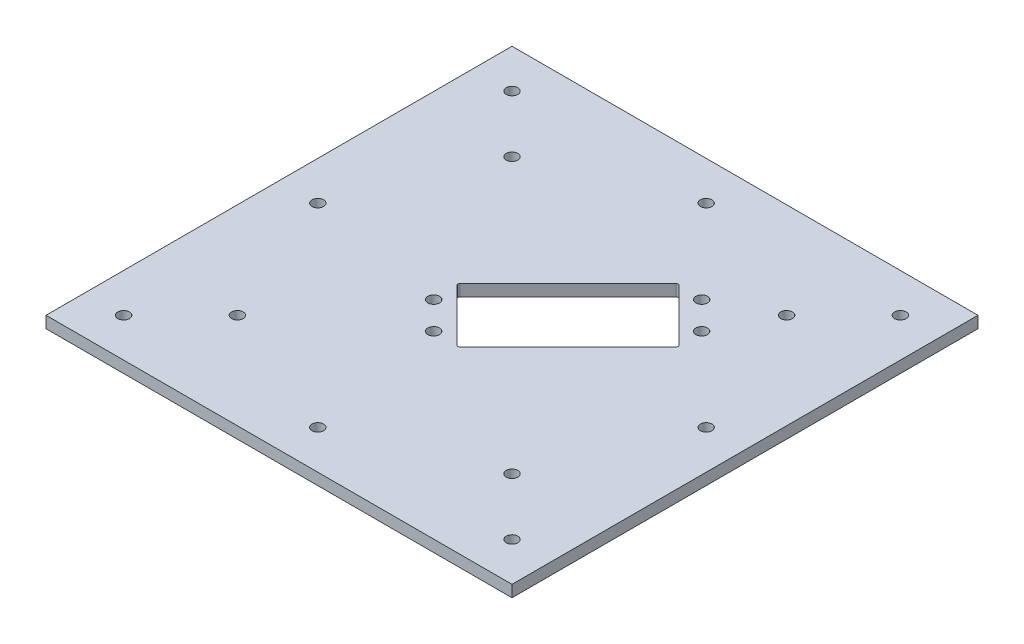
ISO-10303-21;
HEADER;
FILE_DESCRIPTION(('STEP AP214'),'2;1');
FILE_NAME('part.step','',(''),(''),'','','');
FILE_SCHEMA(('AUTOMOTIVE_DESIGN { 1 0 10303 214 1 1 1 1 }'));
ENDSEC;
DATA;
#1=APPLICATION_CONTEXT('core data for automotive mechanical design processes');
#2=APPLICATION_PROTOCOL_DEFINITION('international standard','automotive_design',2000,#1);
#3=PRODUCT_CONTEXT('',#1,'mechanical');
#4=PRODUCT('Part','Part','',(#3));
#5=PRODUCT_RELATED_PRODUCT_CATEGORY('part','',(#4));
#6=PRODUCT_DEFINITION_FORMATION('','',#4);
#7=PRODUCT_DEFINITION_CONTEXT('part definition',#1,'design');
#8=PRODUCT_DEFINITION('design','',#6,#7);
#9=PRODUCT_DEFINITION_SHAPE('','',#8);
#10=(LENGTH_UNIT() NAMED_UNIT(*) SI_UNIT(.MILLI.,.METRE.));
#11=(NAMED_UNIT(*) PLANE_ANGLE_UNIT() SI_UNIT($,.RADIAN.));
#12=(NAMED_UNIT(*) SI_UNIT($,.STERADIAN.) SOLID_ANGLE_UNIT());
#13=UNCERTAINTY_MEASURE_WITH_UNIT(LENGTH_MEASURE(1.E-05),#10,'distance_accuracy_value','');
#14=(GEOMETRIC_REPRESENTATION_CONTEXT(3) GLOBAL_UNCERTAINTY_ASSIGNED_CONTEXT((#13)) GLOBAL_UNIT_ASSIGNED_CONTEXT((#10,
#11,#12)) REPRESENTATION_CONTEXT('',''));
#15=CARTESIAN_POINT('',(0.,0.,0.));
#16=DIRECTION('',(0.,0.,1.));
#17=DIRECTION('',(1.,0.,0.));
#18=AXIS2_PLACEMENT_3D('',#15,#16,#17);
#19=CARTESIAN_POINT('',(0.,3.,0.));
#20=DIRECTION('',(0.,1.,0.));
#21=DIRECTION('',(0.,0.,1.));
#22=AXIS2_PLACEMENT_3D('',#19,#20,#21);
#23=PLANE('',#22);
#24=CARTESIAN_POINT('',(87.9946756076734,3.,39.1543112647893));
#25=DIRECTION('',(0.,1.,0.));
#26=DIRECTION('',(0.,0.,1.));
#27=AXIS2_PLACEMENT_3D('',#24,#25,#26);
#28=CIRCLE('',#27,1.5);
#29=CARTESIAN_POINT('',(87.9946756076734,3.,40.6543112647892));
#30=VERTEX_POINT('',#29);
#31=EDGE_CURVE('E339',#30,#30,#28,.T.);
#32=ORIENTED_EDGE('',*,*,#31,.F.);
#33=EDGE_LOOP('',(#32));
#34=FACE_BOUND('',#33,.T.);
#35=CARTESIAN_POINT('',(46.4167968739045,3.,66.5900543748274));
#36=DIRECTION('',(0.,1.,0.));
#37=DIRECTION('',(0.,0.,1.));
#38=AXIS2_PLACEMENT_3D('',#35,#36,#37);
#39=CIRCLE('',#38,1.50000000000001);
#40=CARTESIAN_POINT('',(46.4167968739045,3.,68.0900543748274));
#41=VERTEX_POINT('',#40);
#42=EDGE_CURVE('E336',#41,#41,#39,.T.);
#43=ORIENTED_EDGE('',*,*,#42,.F.);
#44=EDGE_LOOP('',(#43));
#45=FACE_BOUND('',#44,.T.);
#46=CARTESIAN_POINT('',(80.9236077958079,3.,32.0832434529238));
#47=DIRECTION('',(0.,1.,0.));
#48=DIRECTION('',(0.,0.,1.));
#49=AXIS2_PLACEMENT_3D('',#46,#47,#48);
#50=CIRCLE('',#49,1.5);
#51=CARTESIAN_POINT('',(80.9236077958079,3.,33.5832434529238));
#52=VERTEX_POINT('',#51);
#53=EDGE_CURVE('E330',#52,#52,#50,.T.);
#54=ORIENTED_EDGE('',*,*,#53,.F.);
#55=EDGE_LOOP('',(#54));
#56=FACE_BOUND('',#55,.T.);
#57=CARTESIAN_POINT('',(53.48786468577,3.,73.6611221866929));
#58=DIRECTION('',(0.,1.,0.));
#59=DIRECTION('',(0.,0.,1.));
#60=AXIS2_PLACEMENT_3D('',#57,#58,#59);
#61=CIRCLE('',#60,1.49999999999998);
#62=CARTESIAN_POINT('',(53.48786468577,3.,75.1611221866928));
#63=VERTEX_POINT('',#62);
#64=EDGE_CURVE('E324',#63,#63,#61,.T.);
#65=ORIENTED_EDGE('',*,*,#64,.F.);
#66=EDGE_LOOP('',(#65));
#67=FACE_BOUND('',#66,.T.);
#68=CARTESIAN_POINT('',(9.99999999999999,3.,110.));
#69=DIRECTION('',(0.,1.,0.));
#70=DIRECTION('',(0.,0.,1.));
#71=AXIS2_PLACEMENT_3D('',#68,#69,#70);
#72=CIRCLE('',#71,1.5);
#73=CARTESIAN_POINT('',(9.99999999999999,3.,111.5));
#74=VERTEX_POINT('',#73);
#75=EDGE_CURVE('E306',#74,#74,#72,.T.);
#76=ORIENTED_EDGE('',*,*,#75,.F.);
#77=EDGE_LOOP('',(#76));
#78=FACE_BOUND('',#77,.T.);
#79=CARTESIAN_POINT('',(110.,3.,110.));
#80=DIRECTION('',(0.,1.,0.));
#81=DIRECTION('',(0.,0.,1.));
#82=AXIS2_PLACEMENT_3D('',#79,#80,#81);
#83=CIRCLE('',#82,1.5);
#84=CARTESIAN_POINT('',(110.,3.,111.5));
#85=VERTEX_POINT('',#84);
#86=EDGE_CURVE('E313',#85,#85,#83,.T.);
#87=ORIENTED_EDGE('',*,*,#86,.F.);
#88=EDGE_LOOP('',(#87));
#89=FACE_BOUND('',#88,.T.);
#90=CARTESIAN_POINT('',(110.,3.,10.));
#91=DIRECTION('',(0.,1.,0.));
#92=DIRECTION('',(0.,0.,1.));
#93=AXIS2_PLACEMENT_3D('',#90,#91,#92);
#94=CIRCLE('',#93,1.5);
#95=CARTESIAN_POINT('',(110.,3.,11.5));
#96=VERTEX_POINT('',#95);
#97=EDGE_CURVE('E300',#96,#96,#94,.T.);
#98=ORIENTED_EDGE('',*,*,#97,.F.);
#99=EDGE_LOOP('',(#98));
#100=FACE_BOUND('',#99,.T.);
#101=CARTESIAN_POINT('',(10.,3.,10.));
#102=DIRECTION('',(0.,1.,0.));
#103=DIRECTION('',(0.,0.,1.));
#104=AXIS2_PLACEMENT_3D('',#101,#102,#103);
#105=CIRCLE('',#104,1.5);
#106=CARTESIAN_POINT('',(10.,3.,11.5));
#107=VERTEX_POINT('',#106);
#108=EDGE_CURVE('E297',#107,#107,#105,.T.);
#109=ORIENTED_EDGE('',*,*,#108,.F.);
#110=EDGE_LOOP('',(#109));
#111=FACE_BOUND('',#110,.T.);
#112=CARTESIAN_POINT('',(60.,3.,9.99999999999999));
#113=DIRECTION('',(0.,1.,0.));
#114=DIRECTION('',(0.,0.,1.));
#115=AXIS2_PLACEMENT_3D('',#112,#113,#114);
#116=CIRCLE('',#115,1.5);
#117=CARTESIAN_POINT('',(60.,3.,11.5));
#118=VERTEX_POINT('',#117);
#119=EDGE_CURVE('E249',#118,#118,#116,.T.);
#120=ORIENTED_EDGE('',*,*,#119,.F.);
#121=EDGE_LOOP('',(#120));
#122=FACE_BOUND('',#121,.T.);
#123=CARTESIAN_POINT('',(95.3553390593282,3.,24.6446609406708));
#124=DIRECTION('',(0.,1.,0.));
#125=DIRECTION('',(0.,0.,1.));
#126=AXIS2_PLACEMENT_3D('',#123,#124,#125);
#127=CIRCLE('',#126,1.50000000000001);
#128=CARTESIAN_POINT('',(95.3553390593282,3.,26.1446609406708));
#129=VERTEX_POINT('',#128);
#130=EDGE_CURVE('E292',#129,#129,#127,.T.);
#131=ORIENTED_EDGE('',*,*,#130,.F.);
#132=EDGE_LOOP('',(#131));
#133=FACE_BOUND('',#132,.T.);
#134=CARTESIAN_POINT('',(110.000000000003,3.,59.9999999999975));
#135=DIRECTION('',(0.,1.,0.));
#136=DIRECTION('',(0.,0.,1.));
#137=AXIS2_PLACEMENT_3D('',#134,#135,#136);
#138=CIRCLE('',#137,1.5);
#139=CARTESIAN_POINT('',(110.000000000003,3.,61.4999999999975));
#140=VERTEX_POINT('',#139);
#141=EDGE_CURVE('E286',#140,#140,#138,.T.);
#142=ORIENTED_EDGE('',*,*,#141,.F.);
#143=EDGE_LOOP('',(#142));
#144=FACE_BOUND('',#143,.T.);
#145=CARTESIAN_POINT('',(95.3553390593317,3.,95.3553390593257));
#146=DIRECTION('',(0.,1.,0.));
#147=DIRECTION('',(0.,0.,1.));
#148=AXIS2_PLACEMENT_3D('',#145,#146,#147);
#149=CIRCLE('',#148,1.50000000000001);
#150=CARTESIAN_POINT('',(95.3553390593317,3.,96.8553390593257));
#151=VERTEX_POINT('',#150);
#152=EDGE_CURVE('E280',#151,#151,#149,.T.);
#153=ORIENTED_EDGE('',*,*,#152,.F.);
#154=EDGE_LOOP('',(#153));
#155=FACE_BOUND('',#154,.T.);
#156=CARTESIAN_POINT('',(60.0000000000049,3.,110.));
#157=DIRECTION('',(0.,1.,0.));
#158=DIRECTION('',(0.,0.,1.));
#159=AXIS2_PLACEMENT_3D('',#156,#157,#158);
#160=CIRCLE('',#159,1.5);
#161=CARTESIAN_POINT('',(60.0000000000049,3.,111.5));
#162=VERTEX_POINT('',#161);
#163=EDGE_CURVE('E274',#162,#162,#160,.T.);
#164=ORIENTED_EDGE('',*,*,#163,.F.);
#165=EDGE_LOOP('',(#164));
#166=FACE_BOUND('',#165,.T.);
#167=CARTESIAN_POINT('',(24.6446609406768,3.,95.355339059329));
#168=DIRECTION('',(0.,1.,0.));
#169=DIRECTION('',(0.,0.,1.));
#170=AXIS2_PLACEMENT_3D('',#167,#168,#169);
#171=CIRCLE('',#170,1.50000000000001);
#172=CARTESIAN_POINT('',(24.6446609406768,3.,96.855339059329));
#173=VERTEX_POINT('',#172);
#174=EDGE_CURVE('E268',#173,#173,#171,.T.);
#175=ORIENTED_EDGE('',*,*,#174,.F.);
#176=EDGE_LOOP('',(#175));
#177=FACE_BOUND('',#176,.T.);
#178=CARTESIAN_POINT('',(10.0000000000026,3.,60.0000000000021));
#179=DIRECTION('',(0.,1.,0.));
#180=DIRECTION('',(0.,0.,1.));
#181=AXIS2_PLACEMENT_3D('',#178,#179,#180);
#182=CIRCLE('',#181,1.50000000000001);
#183=CARTESIAN_POINT('',(10.0000000000026,3.,61.5000000000021));
#184=VERTEX_POINT('',#183);
#185=EDGE_CURVE('E262',#184,#184,#182,.T.);
#186=ORIENTED_EDGE('',*,*,#185,.F.);
#187=EDGE_LOOP('',(#186));
#188=FACE_BOUND('',#187,.T.);
#189=CARTESIAN_POINT('',(24.6446609406738,3.,24.6446609406741));
#190=DIRECTION('',(0.,1.,0.));
#191=DIRECTION('',(0.,0.,1.));
#192=AXIS2_PLACEMENT_3D('',#189,#190,#191);
#193=CIRCLE('',#192,1.5);
#194=CARTESIAN_POINT('',(24.6446609406738,3.,26.1446609406741));
#195=VERTEX_POINT('',#194);
#196=EDGE_CURVE('E255',#195,#195,#193,.T.);
#197=ORIENTED_EDGE('',*,*,#196,.F.);
#198=EDGE_LOOP('',(#197));
#199=FACE_BOUND('',#198,.T.);
#200=DIRECTION('',(-0.707106995119461,0.,-0.707106567253569));
#201=VECTOR('',#200,1.);
#202=CARTESIAN_POINT('',(-7.07108382534439,3.,7.0710881040143));
#203=LINE('',#202,#201);
#204=CARTESIAN_POINT('',(59.6464507810986,3.,73.7885823401064));
#205=VERTEX_POINT('',#204);
#206=CARTESIAN_POINT('',(46.2114178738289,2.99999999999931,60.3535575622887));
#207=VERTEX_POINT('',#206);
#208=EDGE_CURVE('E58',#205,#207,#203,.T.);
#209=ORIENTED_EDGE('',*,*,#208,.T.);
#210=CARTESIAN_POINT('',(46.5649711574557,3.,60.000004064729));
#211=DIRECTION('',(0.,1.,0.));
#212=DIRECTION('',(0.,0.,1.));
#213=AXIS2_PLACEMENT_3D('',#210,#211,#212);
#214=CIRCLE('',#213,0.5);
#215=CARTESIAN_POINT('',(46.211417659896,3.,59.6464507811022));
#216=VERTEX_POINT('',#215);
#217=EDGE_CURVE('E174',#216,#207,#214,.T.);
#218=ORIENTED_EDGE('',*,*,#217,.F.);
#219=DIRECTION('',(0.707106567253569,0.,-0.707106995119461));
#220=VECTOR('',#219,1.);
#221=CARTESIAN_POINT('',(52.9289482016136,3.,52.9289161746477));
#222=LINE('',#221,#220);
#223=CARTESIAN_POINT('',(74.0714164096866,3.,31.7864351733954));
#224=VERTEX_POINT('',#223);
#225=EDGE_CURVE('E150',#216,#224,#222,.T.);
#226=ORIENTED_EDGE('',*,*,#225,.T.);
#227=CARTESIAN_POINT('',(74.4249699072463,3.,32.1399884570222));
#228=DIRECTION('',(0.,1.,0.));
#229=DIRECTION('',(0.,0.,1.));
#230=AXIS2_PLACEMENT_3D('',#227,#228,#229);
#231=CIRCLE('',#230,0.5);
#232=CARTESIAN_POINT('',(74.7785231908731,2.99999999999954,31.7864349594625));
#233=VERTEX_POINT('',#232);
#234=EDGE_CURVE('E145',#233,#224,#231,.T.);
#235=ORIENTED_EDGE('',*,*,#234,.F.);
#236=DIRECTION('',(0.707106995119461,0.,0.707106567253569));
#237=VECTOR('',#236,1.);
#238=CARTESIAN_POINT('',(21.4960214916998,3.,-21.496034498812));
#239=LINE('',#238,#237);
#240=CARTESIAN_POINT('',(88.2135560981429,2.99999999999937,45.2214597372803));
#241=VERTEX_POINT('',#240);
#242=EDGE_CURVE('E133',#233,#241,#239,.T.);
#243=ORIENTED_EDGE('',*,*,#242,.T.);
#244=CARTESIAN_POINT('',(87.8600028145161,3.,45.57501323484));
#245=DIRECTION('',(0.,1.,0.));
#246=DIRECTION('',(0.,0.,1.));
#247=AXIS2_PLACEMENT_3D('',#244,#245,#246);
#248=CIRCLE('',#247,0.5);
#249=CARTESIAN_POINT('',(88.2135563120758,3.,45.9285665184668));
#250=VERTEX_POINT('',#249);
#251=EDGE_CURVE('E154',#250,#241,#248,.T.);
#252=ORIENTED_EDGE('',*,*,#251,.F.);
#253=DIRECTION('',(-0.707106567253569,0.,0.707106995119461));
#254=VECTOR('',#253,1.);
#255=CARTESIAN_POINT('',(67.0710881040028,3.,67.071047519719));
#256=LINE('',#255,#254);
#257=CARTESIAN_POINT('',(60.3535575622852,3.,73.7885821261736));
#258=VERTEX_POINT('',#257);
#259=EDGE_CURVE('E144',#250,#258,#256,.T.);
#260=ORIENTED_EDGE('',*,*,#259,.T.);
#261=CARTESIAN_POINT('',(60.0000040647255,3.,73.4350288425468));
#262=DIRECTION('',(0.,1.,0.));
#263=DIRECTION('',(0.,0.,1.));
#264=AXIS2_PLACEMENT_3D('',#261,#262,#263);
#265=CIRCLE('',#264,0.5);
#266=EDGE_CURVE('E172',#205,#258,#265,.T.);
#267=ORIENTED_EDGE('',*,*,#266,.F.);
#268=EDGE_LOOP('',(#209,#218,#226,#235,#243,#252,#260,#267));
#269=FACE_BOUND('',#268,.T.);
#270=DIRECTION('',(0.,0.,1.));
#271=VECTOR('',#270,1.);
#272=CARTESIAN_POINT('',(0.,3.,0.));
#273=LINE('',#272,#271);
#274=CARTESIAN_POINT('',(0.,3.,0.));
#275=VERTEX_POINT('',#274);
#276=CARTESIAN_POINT('',(0.,3.,120.));
#277=VERTEX_POINT('',#276);
#278=EDGE_CURVE('E183',#275,#277,#273,.T.);
#279=ORIENTED_EDGE('',*,*,#278,.T.);
#280=DIRECTION('',(1.,0.,0.));
#281=VECTOR('',#280,1.);
#282=CARTESIAN_POINT('',(0.,3.,120.));
#283=LINE('',#282,#281);
#284=CARTESIAN_POINT('',(120.,3.,120.));
#285=VERTEX_POINT('',#284);
#286=EDGE_CURVE('E186',#277,#285,#283,.T.);
#287=ORIENTED_EDGE('',*,*,#286,.T.);
#288=DIRECTION('',(0.,0.,-1.));
#289=VECTOR('',#288,1.);
#290=CARTESIAN_POINT('',(120.,3.,0.));
#291=LINE('',#290,#289);
#292=CARTESIAN_POINT('',(120.,3.,0.));
#293=VERTEX_POINT('',#292);
#294=EDGE_CURVE('E189',#285,#293,#291,.T.);
#295=ORIENTED_EDGE('',*,*,#294,.T.);
#296=DIRECTION('',(-1.,0.,0.));
#297=VECTOR('',#296,1.);
#298=CARTESIAN_POINT('',(0.,3.,0.));
#299=LINE('',#298,#297);
#300=EDGE_CURVE('E191',#293,#275,#299,.T.);
#301=ORIENTED_EDGE('',*,*,#300,.T.);
#302=EDGE_LOOP('',(#279,#287,#295,#301));
#303=FACE_BOUND('',#302,.T.);
#304=ADVANCED_FACE('F43',(#34,#45,#56,#67,#78,#89,#100,#111,#122,#133,#144,#155,#166,#177,#188,
#199,#269,#303),#23,.T.);
#305=CARTESIAN_POINT('',(0.,3.,0.));
#306=DIRECTION('',(1.,0.,0.));
#307=DIRECTION('',(0.,0.,-1.));
#308=AXIS2_PLACEMENT_3D('',#305,#306,#307);
#309=PLANE('',#308);
#310=DIRECTION('',(0.,0.,1.));
#311=VECTOR('',#310,1.);
#312=CARTESIAN_POINT('',(0.,0.,0.));
#313=LINE('',#312,#311);
#314=CARTESIAN_POINT('',(0.,0.,0.));
#315=VERTEX_POINT('',#314);
#316=CARTESIAN_POINT('',(0.,0.,120.));
#317=VERTEX_POINT('',#316);
#318=EDGE_CURVE('E182',#315,#317,#313,.T.);
#319=ORIENTED_EDGE('',*,*,#318,.T.);
#320=DIRECTION('',(0.,-1.,0.));
#321=VECTOR('',#320,1.);
#322=CARTESIAN_POINT('',(0.,3.,120.));
#323=LINE('',#322,#321);
#324=EDGE_CURVE('E209',#277,#317,#323,.T.);
#325=ORIENTED_EDGE('',*,*,#324,.F.);
#326=ORIENTED_EDGE('',*,*,#278,.F.);
#327=DIRECTION('',(0.,-1.,0.));
#328=VECTOR('',#327,1.);
#329=CARTESIAN_POINT('',(0.,3.,0.));
#330=LINE('',#329,#328);
#331=EDGE_CURVE('E193',#275,#315,#330,.T.);
#332=ORIENTED_EDGE('',*,*,#331,.T.);
#333=EDGE_LOOP('',(#319,#325,#326,#332));
#334=FACE_BOUND('',#333,.T.);
#335=ADVANCED_FACE('F45',(#334),#309,.F.);
#336=CARTESIAN_POINT('',(0.,3.,120.));
#337=DIRECTION('',(0.,0.,-1.));
#338=DIRECTION('',(-1.,0.,0.));
#339=AXIS2_PLACEMENT_3D('',#336,#337,#338);
#340=PLANE('',#339);
#341=DIRECTION('',(1.,0.,0.));
#342=VECTOR('',#341,1.);
#343=CARTESIAN_POINT('',(0.,0.,120.));
#344=LINE('',#343,#342);
#345=CARTESIAN_POINT('',(120.,0.,120.));
#346=VERTEX_POINT('',#345);
#347=EDGE_CURVE('E196',#317,#346,#344,.T.);
#348=ORIENTED_EDGE('',*,*,#347,.T.);
#349=DIRECTION('',(0.,-1.,0.));
#350=VECTOR('',#349,1.);
#351=CARTESIAN_POINT('',(120.,3.,120.));
#352=LINE('',#351,#350);
#353=EDGE_CURVE('E206',#285,#346,#352,.T.);
#354=ORIENTED_EDGE('',*,*,#353,.F.);
#355=ORIENTED_EDGE('',*,*,#286,.F.);
#356=ORIENTED_EDGE('',*,*,#324,.T.);
#357=EDGE_LOOP('',(#348,#354,#355,#356));
#358=FACE_BOUND('',#357,.T.);
#359=ADVANCED_FACE('F425',(#358),#340,.F.);
#360=CARTESIAN_POINT('',(120.,3.,0.));
#361=DIRECTION('',(-1.,0.,0.));
#362=DIRECTION('',(0.,0.,1.));
#363=AXIS2_PLACEMENT_3D('',#360,#361,#362);
#364=PLANE('',#363);
#365=DIRECTION('',(0.,0.,-1.));
#366=VECTOR('',#365,1.);
#367=CARTESIAN_POINT('',(120.,0.,0.));
#368=LINE('',#367,#366);
#369=CARTESIAN_POINT('',(120.,0.,0.));
#370=VERTEX_POINT('',#369);
#371=EDGE_CURVE('E198',#346,#370,#368,.T.);
#372=ORIENTED_EDGE('',*,*,#371,.T.);
#373=DIRECTION('',(0.,-1.,0.));
#374=VECTOR('',#373,1.);
#375=CARTESIAN_POINT('',(120.,3.,0.));
#376=LINE('',#375,#374);
#377=EDGE_CURVE('E203',#293,#370,#376,.T.);
#378=ORIENTED_EDGE('',*,*,#377,.F.);
#379=ORIENTED_EDGE('',*,*,#294,.F.);
#380=ORIENTED_EDGE('',*,*,#353,.T.);
#381=EDGE_LOOP('',(#372,#378,#379,#380));
#382=FACE_BOUND('',#381,.T.);
#383=ADVANCED_FACE('F422',(#382),#364,.F.);
#384=CARTESIAN_POINT('',(0.,3.,0.));
#385=DIRECTION('',(0.,0.,1.));
#386=DIRECTION('',(1.,0.,0.));
#387=AXIS2_PLACEMENT_3D('',#384,#385,#386);
#388=PLANE('',#387);
#389=DIRECTION('',(-1.,0.,0.));
#390=VECTOR('',#389,1.);
#391=CARTESIAN_POINT('',(0.,0.,0.));
#392=LINE('',#391,#390);
#393=EDGE_CURVE('E187',#370,#315,#392,.T.);
#394=ORIENTED_EDGE('',*,*,#393,.T.);
#395=ORIENTED_EDGE('',*,*,#331,.F.);
#396=ORIENTED_EDGE('',*,*,#300,.F.);
#397=ORIENTED_EDGE('',*,*,#377,.T.);
#398=EDGE_LOOP('',(#394,#395,#396,#397));
#399=FACE_BOUND('',#398,.T.);
#400=ADVANCED_FACE('F419',(#399),#388,.F.);
#401=CARTESIAN_POINT('',(0.,0.,0.));
#402=DIRECTION('',(0.,1.,0.));
#403=DIRECTION('',(0.,0.,1.));
#404=AXIS2_PLACEMENT_3D('',#401,#402,#403);
#405=PLANE('',#404);
#406=CARTESIAN_POINT('',(87.9946756076734,0.,39.1543112647893));
#407=DIRECTION('',(0.,1.,0.));
#408=DIRECTION('',(0.,0.,1.));
#409=AXIS2_PLACEMENT_3D('',#406,#407,#408);
#410=CIRCLE('',#409,1.5);
#411=CARTESIAN_POINT('',(87.9946756076734,0.,40.6543112647892));
#412=VERTEX_POINT('',#411);
#413=EDGE_CURVE('E307',#412,#412,#410,.T.);
#414=ORIENTED_EDGE('',*,*,#413,.T.);
#415=EDGE_LOOP('',(#414));
#416=FACE_BOUND('',#415,.T.);
#417=CARTESIAN_POINT('',(46.4167968739045,0.,66.5900543748274));
#418=DIRECTION('',(0.,1.,0.));
#419=DIRECTION('',(0.,0.,1.));
#420=AXIS2_PLACEMENT_3D('',#417,#418,#419);
#421=CIRCLE('',#420,1.50000000000001);
#422=CARTESIAN_POINT('',(46.4167968739045,0.,68.0900543748274));
#423=VERTEX_POINT('',#422);
#424=EDGE_CURVE('E333',#423,#423,#421,.T.);
#425=ORIENTED_EDGE('',*,*,#424,.T.);
#426=EDGE_LOOP('',(#425));
#427=FACE_BOUND('',#426,.T.);
#428=CARTESIAN_POINT('',(80.9236077958079,0.,32.0832434529238));
#429=DIRECTION('',(0.,1.,0.));
#430=DIRECTION('',(0.,0.,1.));
#431=AXIS2_PLACEMENT_3D('',#428,#429,#430);
#432=CIRCLE('',#431,1.5);
#433=CARTESIAN_POINT('',(80.9236077958079,0.,33.5832434529238));
#434=VERTEX_POINT('',#433);
#435=EDGE_CURVE('E327',#434,#434,#432,.T.);
#436=ORIENTED_EDGE('',*,*,#435,.T.);
#437=EDGE_LOOP('',(#436));
#438=FACE_BOUND('',#437,.T.);
#439=CARTESIAN_POINT('',(53.48786468577,0.,73.6611221866929));
#440=DIRECTION('',(0.,1.,0.));
#441=DIRECTION('',(0.,0.,1.));
#442=AXIS2_PLACEMENT_3D('',#439,#440,#441);
#443=CIRCLE('',#442,1.49999999999998);
#444=CARTESIAN_POINT('',(53.48786468577,0.,75.1611221866928));
#445=VERTEX_POINT('',#444);
#446=EDGE_CURVE('E321',#445,#445,#443,.T.);
#447=ORIENTED_EDGE('',*,*,#446,.T.);
#448=EDGE_LOOP('',(#447));
#449=FACE_BOUND('',#448,.T.);
#450=CARTESIAN_POINT('',(9.99999999999999,0.,110.));
#451=DIRECTION('',(0.,1.,0.));
#452=DIRECTION('',(0.,0.,1.));
#453=AXIS2_PLACEMENT_3D('',#450,#451,#452);
#454=CIRCLE('',#453,1.5);
#455=CARTESIAN_POINT('',(9.99999999999999,0.,111.5));
#456=VERTEX_POINT('',#455);
#457=EDGE_CURVE('E303',#456,#456,#454,.T.);
#458=ORIENTED_EDGE('',*,*,#457,.T.);
#459=EDGE_LOOP('',(#458));
#460=FACE_BOUND('',#459,.T.);
#461=CARTESIAN_POINT('',(110.,0.,110.));
#462=DIRECTION('',(0.,1.,0.));
#463=DIRECTION('',(0.,0.,1.));
#464=AXIS2_PLACEMENT_3D('',#461,#462,#463);
#465=CIRCLE('',#464,1.5);
#466=CARTESIAN_POINT('',(110.,0.,111.5));
#467=VERTEX_POINT('',#466);
#468=EDGE_CURVE('E310',#467,#467,#465,.T.);
#469=ORIENTED_EDGE('',*,*,#468,.T.);
#470=EDGE_LOOP('',(#469));
#471=FACE_BOUND('',#470,.T.);
#472=CARTESIAN_POINT('',(110.,0.,10.));
#473=DIRECTION('',(0.,1.,0.));
#474=DIRECTION('',(0.,0.,1.));
#475=AXIS2_PLACEMENT_3D('',#472,#473,#474);
#476=CIRCLE('',#475,1.5);
#477=CARTESIAN_POINT('',(110.,0.,11.5));
#478=VERTEX_POINT('',#477);
#479=EDGE_CURVE('E316',#478,#478,#476,.T.);
#480=ORIENTED_EDGE('',*,*,#479,.T.);
#481=EDGE_LOOP('',(#480));
#482=FACE_BOUND('',#481,.T.);
#483=CARTESIAN_POINT('',(10.,0.,10.));
#484=DIRECTION('',(0.,1.,0.));
#485=DIRECTION('',(0.,0.,1.));
#486=AXIS2_PLACEMENT_3D('',#483,#484,#485);
#487=CIRCLE('',#486,1.5);
#488=CARTESIAN_POINT('',(10.,0.,11.5));
#489=VERTEX_POINT('',#488);
#490=EDGE_CURVE('E256',#489,#489,#487,.T.);
#491=ORIENTED_EDGE('',*,*,#490,.T.);
#492=EDGE_LOOP('',(#491));
#493=FACE_BOUND('',#492,.T.);
#494=CARTESIAN_POINT('',(60.,0.,9.99999999999999));
#495=DIRECTION('',(0.,1.,0.));
#496=DIRECTION('',(0.,0.,1.));
#497=AXIS2_PLACEMENT_3D('',#494,#495,#496);
#498=CIRCLE('',#497,1.5);
#499=CARTESIAN_POINT('',(60.,0.,11.5));
#500=VERTEX_POINT('',#499);
#501=EDGE_CURVE('E246',#500,#500,#498,.T.);
#502=ORIENTED_EDGE('',*,*,#501,.T.);
#503=EDGE_LOOP('',(#502));
#504=FACE_BOUND('',#503,.T.);
#505=CARTESIAN_POINT('',(95.3553390593282,0.,24.6446609406708));
#506=DIRECTION('',(0.,1.,0.));
#507=DIRECTION('',(0.,0.,1.));
#508=AXIS2_PLACEMENT_3D('',#505,#506,#507);
#509=CIRCLE('',#508,1.50000000000001);
#510=CARTESIAN_POINT('',(95.3553390593282,0.,26.1446609406708));
#511=VERTEX_POINT('',#510);
#512=EDGE_CURVE('E289',#511,#511,#509,.T.);
#513=ORIENTED_EDGE('',*,*,#512,.T.);
#514=EDGE_LOOP('',(#513));
#515=FACE_BOUND('',#514,.T.);
#516=CARTESIAN_POINT('',(110.000000000003,0.,59.9999999999975));
#517=DIRECTION('',(0.,1.,0.));
#518=DIRECTION('',(0.,0.,1.));
#519=AXIS2_PLACEMENT_3D('',#516,#517,#518);
#520=CIRCLE('',#519,1.5);
#521=CARTESIAN_POINT('',(110.000000000003,0.,61.4999999999975));
#522=VERTEX_POINT('',#521);
#523=EDGE_CURVE('E283',#522,#522,#520,.T.);
#524=ORIENTED_EDGE('',*,*,#523,.T.);
#525=EDGE_LOOP('',(#524));
#526=FACE_BOUND('',#525,.T.);
#527=CARTESIAN_POINT('',(95.3553390593317,0.,95.3553390593257));
#528=DIRECTION('',(0.,1.,0.));
#529=DIRECTION('',(0.,0.,1.));
#530=AXIS2_PLACEMENT_3D('',#527,#528,#529);
#531=CIRCLE('',#530,1.50000000000001);
#532=CARTESIAN_POINT('',(95.3553390593317,0.,96.8553390593257));
#533=VERTEX_POINT('',#532);
#534=EDGE_CURVE('E277',#533,#533,#531,.T.);
#535=ORIENTED_EDGE('',*,*,#534,.T.);
#536=EDGE_LOOP('',(#535));
#537=FACE_BOUND('',#536,.T.);
#538=CARTESIAN_POINT('',(60.0000000000049,0.,110.));
#539=DIRECTION('',(0.,1.,0.));
#540=DIRECTION('',(0.,0.,1.));
#541=AXIS2_PLACEMENT_3D('',#538,#539,#540);
#542=CIRCLE('',#541,1.5);
#543=CARTESIAN_POINT('',(60.0000000000049,0.,111.5));
#544=VERTEX_POINT('',#543);
#545=EDGE_CURVE('E271',#544,#544,#542,.T.);
#546=ORIENTED_EDGE('',*,*,#545,.T.);
#547=EDGE_LOOP('',(#546));
#548=FACE_BOUND('',#547,.T.);
#549=CARTESIAN_POINT('',(24.6446609406768,0.,95.355339059329));
#550=DIRECTION('',(0.,1.,0.));
#551=DIRECTION('',(0.,0.,1.));
#552=AXIS2_PLACEMENT_3D('',#549,#550,#551);
#553=CIRCLE('',#552,1.50000000000001);
#554=CARTESIAN_POINT('',(24.6446609406768,0.,96.855339059329));
#555=VERTEX_POINT('',#554);
#556=EDGE_CURVE('E265',#555,#555,#553,.T.);
#557=ORIENTED_EDGE('',*,*,#556,.T.);
#558=EDGE_LOOP('',(#557));
#559=FACE_BOUND('',#558,.T.);
#560=CARTESIAN_POINT('',(10.0000000000026,0.,60.0000000000021));
#561=DIRECTION('',(0.,1.,0.));
#562=DIRECTION('',(0.,0.,1.));
#563=AXIS2_PLACEMENT_3D('',#560,#561,#562);
#564=CIRCLE('',#563,1.50000000000001);
#565=CARTESIAN_POINT('',(10.0000000000026,0.,61.5000000000021));
#566=VERTEX_POINT('',#565);
#567=EDGE_CURVE('E259',#566,#566,#564,.T.);
#568=ORIENTED_EDGE('',*,*,#567,.T.);
#569=EDGE_LOOP('',(#568));
#570=FACE_BOUND('',#569,.T.);
#571=CARTESIAN_POINT('',(24.6446609406738,0.,24.6446609406741));
#572=DIRECTION('',(0.,1.,0.));
#573=DIRECTION('',(0.,0.,1.));
#574=AXIS2_PLACEMENT_3D('',#571,#572,#573);
#575=CIRCLE('',#574,1.5);
#576=CARTESIAN_POINT('',(24.6446609406738,0.,26.1446609406741));
#577=VERTEX_POINT('',#576);
#578=EDGE_CURVE('E252',#577,#577,#575,.T.);
#579=ORIENTED_EDGE('',*,*,#578,.T.);
#580=EDGE_LOOP('',(#579));
#581=FACE_BOUND('',#580,.T.);
#582=DIRECTION('',(0.707106995119461,0.,0.707106567253569));
#583=VECTOR('',#582,1.);
#584=CARTESIAN_POINT('',(21.4960214916998,0.,-21.496034498812));
#585=LINE('',#584,#583);
#586=CARTESIAN_POINT('',(74.7785231908731,0.,31.7864349594625));
#587=VERTEX_POINT('',#586);
#588=CARTESIAN_POINT('',(88.2135560981429,0.,45.2214597372803));
#589=VERTEX_POINT('',#588);
#590=EDGE_CURVE('E225',#587,#589,#585,.T.);
#591=ORIENTED_EDGE('',*,*,#590,.F.);
#592=CARTESIAN_POINT('',(74.4249699072463,0.,32.1399884570222));
#593=DIRECTION('',(0.,1.,0.));
#594=DIRECTION('',(0.,0.,1.));
#595=AXIS2_PLACEMENT_3D('',#592,#593,#594);
#596=CIRCLE('',#595,0.5);
#597=CARTESIAN_POINT('',(74.0714164096866,0.,31.7864351733954));
#598=VERTEX_POINT('',#597);
#599=EDGE_CURVE('E11',#587,#598,#596,.T.);
#600=ORIENTED_EDGE('',*,*,#599,.T.);
#601=DIRECTION('',(0.707106567253569,0.,-0.707106995119461));
#602=VECTOR('',#601,1.);
#603=CARTESIAN_POINT('',(52.9289482016136,0.,52.9289161746476));
#604=LINE('',#603,#602);
#605=CARTESIAN_POINT('',(46.211417659896,0.,59.6464507811022));
#606=VERTEX_POINT('',#605);
#607=EDGE_CURVE('E51',#606,#598,#604,.T.);
#608=ORIENTED_EDGE('',*,*,#607,.F.);
#609=CARTESIAN_POINT('',(46.5649711574557,0.,60.000004064729));
#610=DIRECTION('',(0.,1.,0.));
#611=DIRECTION('',(0.,0.,1.));
#612=AXIS2_PLACEMENT_3D('',#609,#610,#611);
#613=CIRCLE('',#612,0.5);
#614=CARTESIAN_POINT('',(46.2114178738289,0.,60.3535575622887));
#615=VERTEX_POINT('',#614);
#616=EDGE_CURVE('E219',#606,#615,#613,.T.);
#617=ORIENTED_EDGE('',*,*,#616,.T.);
#618=DIRECTION('',(-0.707106995119461,0.,-0.707106567253569));
#619=VECTOR('',#618,1.);
#620=CARTESIAN_POINT('',(-7.07108382534438,0.,7.07108810401429));
#621=LINE('',#620,#619);
#622=CARTESIAN_POINT('',(59.6464507810987,0.,73.7885823401065));
#623=VERTEX_POINT('',#622);
#624=EDGE_CURVE('E217',#623,#615,#621,.T.);
#625=ORIENTED_EDGE('',*,*,#624,.F.);
#626=CARTESIAN_POINT('',(60.0000040647255,0.,73.4350288425468));
#627=DIRECTION('',(0.,1.,0.));
#628=DIRECTION('',(0.,0.,1.));
#629=AXIS2_PLACEMENT_3D('',#626,#627,#628);
#630=CIRCLE('',#629,0.5);
#631=CARTESIAN_POINT('',(60.3535575622853,0.,73.7885821261735));
#632=VERTEX_POINT('',#631);
#633=EDGE_CURVE('E212',#623,#632,#630,.T.);
#634=ORIENTED_EDGE('',*,*,#633,.T.);
#635=DIRECTION('',(-0.707106567253569,0.,0.707106995119461));
#636=VECTOR('',#635,1.);
#637=CARTESIAN_POINT('',(67.0710881040028,0.,67.071047519719));
#638=LINE('',#637,#636);
#639=CARTESIAN_POINT('',(88.2135563120758,0.,45.9285665184668));
#640=VERTEX_POINT('',#639);
#641=EDGE_CURVE('E215',#640,#632,#638,.T.);
#642=ORIENTED_EDGE('',*,*,#641,.F.);
#643=CARTESIAN_POINT('',(87.8600028145161,0.,45.57501323484));
#644=DIRECTION('',(0.,1.,0.));
#645=DIRECTION('',(0.,0.,1.));
#646=AXIS2_PLACEMENT_3D('',#643,#644,#645);
#647=CIRCLE('',#646,0.5);
#648=EDGE_CURVE('E222',#640,#589,#647,.T.);
#649=ORIENTED_EDGE('',*,*,#648,.T.);
#650=EDGE_LOOP('',(#591,#600,#608,#617,#625,#634,#642,#649));
#651=FACE_BOUND('',#650,.T.);
#652=ORIENTED_EDGE('',*,*,#318,.F.);
#653=ORIENTED_EDGE('',*,*,#393,.F.);
#654=ORIENTED_EDGE('',*,*,#371,.F.);
#655=ORIENTED_EDGE('',*,*,#347,.F.);
#656=EDGE_LOOP('',(#652,#653,#654,#655));
#657=FACE_BOUND('',#656,.T.);
#658=ADVANCED_FACE('F233',(#416,#427,#438,#449,#460,#471,#482,#493,#504,#515,#526,#537,#548,
#559,#570,#581,#651,#657),#405,.F.);
#659=CARTESIAN_POINT('',(45.8578643762692,2.99999999999932,60.0000042786619));
#660=DIRECTION('',(0.707106567253569,0.,-0.707106995119461));
#661=DIRECTION('',(-0.707106995119461,0.,-0.707106567253569));
#662=AXIS2_PLACEMENT_3D('',#659,#660,#661);
#663=PLANE('',#662);
#664=ORIENTED_EDGE('',*,*,#208,.F.);
#665=DIRECTION('',(0.,-1.,0.));
#666=VECTOR('',#665,1.);
#667=CARTESIAN_POINT('',(59.6464507810987,2.99999999999914,73.7885823401065));
#668=LINE('',#667,#666);
#669=EDGE_CURVE('E166',#623,#205,#668,.F.);
#670=ORIENTED_EDGE('',*,*,#669,.F.);
#671=ORIENTED_EDGE('',*,*,#624,.T.);
#672=DIRECTION('',(0.,-1.,0.));
#673=VECTOR('',#672,1.);
#674=CARTESIAN_POINT('',(46.2114178738289,2.99999999999931,60.3535575622887));
#675=LINE('',#674,#673);
#676=EDGE_CURVE('E169',#207,#615,#675,.T.);
#677=ORIENTED_EDGE('',*,*,#676,.F.);
#678=EDGE_LOOP('',(#664,#670,#671,#677));
#679=FACE_BOUND('',#678,.T.);
#680=ADVANCED_FACE('F243',(#679),#663,.T.);
#681=CARTESIAN_POINT('',(45.8578643762692,2.99999999999932,60.0000042786619));
#682=DIRECTION('',(0.707106995119461,0.,0.707106567253569));
#683=DIRECTION('',(0.707106567253569,0.,-0.707106995119461));
#684=AXIS2_PLACEMENT_3D('',#681,#682,#683);
#685=PLANE('',#684);
#686=DIRECTION('',(0.,-1.,0.));
#687=VECTOR('',#686,1.);
#688=CARTESIAN_POINT('',(46.211417659896,2.99999999999932,59.6464507811022));
#689=LINE('',#688,#687);
#690=EDGE_CURVE('E231',#606,#216,#689,.F.);
#691=ORIENTED_EDGE('',*,*,#690,.F.);
#692=ORIENTED_EDGE('',*,*,#607,.T.);
#693=DIRECTION('',(0.,-1.,0.));
#694=VECTOR('',#693,1.);
#695=CARTESIAN_POINT('',(74.0714164096866,2.99999999999954,31.7864351733954));
#696=LINE('',#695,#694);
#697=EDGE_CURVE('E160',#224,#598,#696,.T.);
#698=ORIENTED_EDGE('',*,*,#697,.F.);
#699=ORIENTED_EDGE('',*,*,#225,.F.);
#700=EDGE_LOOP('',(#691,#692,#698,#699));
#701=FACE_BOUND('',#700,.T.);
#702=ADVANCED_FACE('F229',(#701),#685,.T.);
#703=CARTESIAN_POINT('',(60.0000042786584,2.99999999999914,74.1421356237333));
#704=DIRECTION('',(-0.707106995119461,0.,-0.707106567253569));
#705=DIRECTION('',(-0.707106567253569,0.,0.707106995119461));
#706=AXIS2_PLACEMENT_3D('',#703,#704,#705);
#707=PLANE('',#706);
#708=DIRECTION('',(0.,-1.,0.));
#709=VECTOR('',#708,1.);
#710=CARTESIAN_POINT('',(88.2135563120758,2.99999999999936,45.9285665184668));
#711=LINE('',#710,#709);
#712=EDGE_CURVE('E158',#640,#250,#711,.F.);
#713=ORIENTED_EDGE('',*,*,#712,.F.);
#714=ORIENTED_EDGE('',*,*,#641,.T.);
#715=DIRECTION('',(0.,-1.,0.));
#716=VECTOR('',#715,1.);
#717=CARTESIAN_POINT('',(60.3535575622852,2.99999999999914,73.7885821261736));
#718=LINE('',#717,#716);
#719=EDGE_CURVE('E66',#258,#632,#718,.T.);
#720=ORIENTED_EDGE('',*,*,#719,.F.);
#721=ORIENTED_EDGE('',*,*,#259,.F.);
#722=EDGE_LOOP('',(#713,#714,#720,#721));
#723=FACE_BOUND('',#722,.T.);
#724=ADVANCED_FACE('F240',(#723),#707,.T.);
#725=CARTESIAN_POINT('',(74.4249696933134,2.99999999999954,31.4328816758357));
#726=DIRECTION('',(-0.707106567253569,0.,0.707106995119461));
#727=DIRECTION('',(0.707106995119461,0.,0.707106567253569));
#728=AXIS2_PLACEMENT_3D('',#725,#726,#727);
#729=PLANE('',#728);
#730=ORIENTED_EDGE('',*,*,#242,.F.);
#731=DIRECTION('',(0.,-1.,0.));
#732=VECTOR('',#731,1.);
#733=CARTESIAN_POINT('',(74.7785231908731,2.99999999999954,31.7864349594625));
#734=LINE('',#733,#732);
#735=EDGE_CURVE('E137',#587,#233,#734,.F.);
#736=ORIENTED_EDGE('',*,*,#735,.F.);
#737=ORIENTED_EDGE('',*,*,#590,.T.);
#738=DIRECTION('',(0.,-1.,0.));
#739=VECTOR('',#738,1.);
#740=CARTESIAN_POINT('',(88.2135560981429,2.99999999999937,45.2214597372803));
#741=LINE('',#740,#739);
#742=EDGE_CURVE('E140',#241,#589,#741,.T.);
#743=ORIENTED_EDGE('',*,*,#742,.F.);
#744=EDGE_LOOP('',(#730,#736,#737,#743));
#745=FACE_BOUND('',#744,.T.);
#746=ADVANCED_FACE('F135',(#745),#729,.T.);
#747=CARTESIAN_POINT('',(74.4249699072463,2.99999999999954,32.1399884570222));
#748=DIRECTION('',(0.,-1.,0.));
#749=DIRECTION('',(-0.707106995119461,0.,-0.707106567253569));
#750=AXIS2_PLACEMENT_3D('',#747,#748,#749);
#751=CYLINDRICAL_SURFACE('',#750,0.5);
#752=ORIENTED_EDGE('',*,*,#234,.T.);
#753=ORIENTED_EDGE('',*,*,#697,.T.);
#754=ORIENTED_EDGE('',*,*,#599,.F.);
#755=ORIENTED_EDGE('',*,*,#735,.T.);
#756=EDGE_LOOP('',(#752,#753,#754,#755));
#757=FACE_BOUND('',#756,.T.);
#758=ADVANCED_FACE('F156',(#757),#751,.F.);
#759=CARTESIAN_POINT('',(87.8600028145161,2.99999999999936,45.57501323484));
#760=DIRECTION('',(0.,-1.,0.));
#761=DIRECTION('',(-0.707106995119461,0.,-0.707106567253569));
#762=AXIS2_PLACEMENT_3D('',#759,#760,#761);
#763=CYLINDRICAL_SURFACE('',#762,0.5);
#764=ORIENTED_EDGE('',*,*,#251,.T.);
#765=ORIENTED_EDGE('',*,*,#742,.T.);
#766=ORIENTED_EDGE('',*,*,#648,.F.);
#767=ORIENTED_EDGE('',*,*,#712,.T.);
#768=EDGE_LOOP('',(#764,#765,#766,#767));
#769=FACE_BOUND('',#768,.T.);
#770=ADVANCED_FACE('F237',(#769),#763,.F.);
#771=CARTESIAN_POINT('',(46.5649711574557,2.99999999999932,60.000004064729));
#772=DIRECTION('',(0.,-1.,0.));
#773=DIRECTION('',(-0.707106995119461,0.,-0.707106567253569));
#774=AXIS2_PLACEMENT_3D('',#771,#772,#773);
#775=CYLINDRICAL_SURFACE('',#774,0.5);
#776=ORIENTED_EDGE('',*,*,#217,.T.);
#777=ORIENTED_EDGE('',*,*,#676,.T.);
#778=ORIENTED_EDGE('',*,*,#616,.F.);
#779=ORIENTED_EDGE('',*,*,#690,.T.);
#780=EDGE_LOOP('',(#776,#777,#778,#779));
#781=FACE_BOUND('',#780,.T.);
#782=ADVANCED_FACE('F245',(#781),#775,.F.);
#783=CARTESIAN_POINT('',(60.0000040647255,2.99999999999914,73.4350288425468));
#784=DIRECTION('',(0.,-1.,0.));
#785=DIRECTION('',(-0.707106995119461,0.,-0.707106567253569));
#786=AXIS2_PLACEMENT_3D('',#783,#784,#785);
#787=CYLINDRICAL_SURFACE('',#786,0.5);
#788=ORIENTED_EDGE('',*,*,#266,.T.);
#789=ORIENTED_EDGE('',*,*,#719,.T.);
#790=ORIENTED_EDGE('',*,*,#633,.F.);
#791=ORIENTED_EDGE('',*,*,#669,.T.);
#792=EDGE_LOOP('',(#788,#789,#790,#791));
#793=FACE_BOUND('',#792,.T.);
#794=ADVANCED_FACE('F242',(#793),#787,.F.);
#795=CARTESIAN_POINT('',(24.6446609406738,0.,24.6446609406741));
#796=DIRECTION('',(0.,1.,0.));
#797=DIRECTION('',(0.,0.,1.));
#798=AXIS2_PLACEMENT_3D('',#795,#796,#797);
#799=CYLINDRICAL_SURFACE('',#798,1.5);
#800=ORIENTED_EDGE('',*,*,#578,.F.);
#801=EDGE_LOOP('',(#800));
#802=FACE_BOUND('',#801,.T.);
#803=ORIENTED_EDGE('',*,*,#196,.T.);
#804=EDGE_LOOP('',(#803));
#805=FACE_BOUND('',#804,.T.);
#806=ADVANCED_FACE('F387',(#802,#805),#799,.F.);
#807=CARTESIAN_POINT('',(10.0000000000026,0.,60.0000000000021));
#808=DIRECTION('',(0.,1.,0.));
#809=DIRECTION('',(0.,0.,1.));
#810=AXIS2_PLACEMENT_3D('',#807,#808,#809);
#811=CYLINDRICAL_SURFACE('',#810,1.50000000000001);
#812=ORIENTED_EDGE('',*,*,#567,.F.);
#813=EDGE_LOOP('',(#812));
#814=FACE_BOUND('',#813,.T.);
#815=ORIENTED_EDGE('',*,*,#185,.T.);
#816=EDGE_LOOP('',(#815));
#817=FACE_BOUND('',#816,.T.);
#818=ADVANCED_FACE('F389',(#814,#817),#811,.F.);
#819=CARTESIAN_POINT('',(24.6446609406768,0.,95.355339059329));
#820=DIRECTION('',(0.,1.,0.));
#821=DIRECTION('',(0.,0.,1.));
#822=AXIS2_PLACEMENT_3D('',#819,#820,#821);
#823=CYLINDRICAL_SURFACE('',#822,1.50000000000001);
#824=ORIENTED_EDGE('',*,*,#556,.F.);
#825=EDGE_LOOP('',(#824));
#826=FACE_BOUND('',#825,.T.);
#827=ORIENTED_EDGE('',*,*,#174,.T.);
#828=EDGE_LOOP('',(#827));
#829=FACE_BOUND('',#828,.T.);
#830=ADVANCED_FACE('F396',(#826,#829),#823,.F.);
#831=CARTESIAN_POINT('',(60.0000000000049,0.,110.));
#832=DIRECTION('',(0.,1.,0.));
#833=DIRECTION('',(0.,0.,1.));
#834=AXIS2_PLACEMENT_3D('',#831,#832,#833);
#835=CYLINDRICAL_SURFACE('',#834,1.5);
#836=ORIENTED_EDGE('',*,*,#545,.F.);
#837=EDGE_LOOP('',(#836));
#838=FACE_BOUND('',#837,.T.);
#839=ORIENTED_EDGE('',*,*,#163,.T.);
#840=EDGE_LOOP('',(#839));
#841=FACE_BOUND('',#840,.T.);
#842=ADVANCED_FACE('F541',(#838,#841),#835,.F.);
#843=CARTESIAN_POINT('',(95.3553390593317,0.,95.3553390593257));
#844=DIRECTION('',(0.,1.,0.));
#845=DIRECTION('',(0.,0.,1.));
#846=AXIS2_PLACEMENT_3D('',#843,#844,#845);
#847=CYLINDRICAL_SURFACE('',#846,1.50000000000001);
#848=ORIENTED_EDGE('',*,*,#534,.F.);
#849=EDGE_LOOP('',(#848));
#850=FACE_BOUND('',#849,.T.);
#851=ORIENTED_EDGE('',*,*,#152,.T.);
#852=EDGE_LOOP('',(#851));
#853=FACE_BOUND('',#852,.T.);
#854=ADVANCED_FACE('F550',(#850,#853),#847,.F.);
#855=CARTESIAN_POINT('',(110.000000000003,0.,59.9999999999975));
#856=DIRECTION('',(0.,1.,0.));
#857=DIRECTION('',(0.,0.,1.));
#858=AXIS2_PLACEMENT_3D('',#855,#856,#857);
#859=CYLINDRICAL_SURFACE('',#858,1.5);
#860=ORIENTED_EDGE('',*,*,#523,.F.);
#861=EDGE_LOOP('',(#860));
#862=FACE_BOUND('',#861,.T.);
#863=ORIENTED_EDGE('',*,*,#141,.T.);
#864=EDGE_LOOP('',(#863));
#865=FACE_BOUND('',#864,.T.);
#866=ADVANCED_FACE('F560',(#862,#865),#859,.F.);
#867=CARTESIAN_POINT('',(95.3553390593282,0.,24.6446609406708));
#868=DIRECTION('',(0.,1.,0.));
#869=DIRECTION('',(0.,0.,1.));
#870=AXIS2_PLACEMENT_3D('',#867,#868,#869);
#871=CYLINDRICAL_SURFACE('',#870,1.50000000000001);
#872=ORIENTED_EDGE('',*,*,#512,.F.);
#873=EDGE_LOOP('',(#872));
#874=FACE_BOUND('',#873,.T.);
#875=ORIENTED_EDGE('',*,*,#130,.T.);
#876=EDGE_LOOP('',(#875));
#877=FACE_BOUND('',#876,.T.);
#878=ADVANCED_FACE('F570',(#874,#877),#871,.F.);
#879=CARTESIAN_POINT('',(60.,0.,9.99999999999999));
#880=DIRECTION('',(0.,1.,0.));
#881=DIRECTION('',(0.,0.,1.));
#882=AXIS2_PLACEMENT_3D('',#879,#880,#881);
#883=CYLINDRICAL_SURFACE('',#882,1.5);
#884=ORIENTED_EDGE('',*,*,#501,.F.);
#885=EDGE_LOOP('',(#884));
#886=FACE_BOUND('',#885,.T.);
#887=ORIENTED_EDGE('',*,*,#119,.T.);
#888=EDGE_LOOP('',(#887));
#889=FACE_BOUND('',#888,.T.);
#890=ADVANCED_FACE('F580',(#886,#889),#883,.F.);
#891=CARTESIAN_POINT('',(10.,0.,10.));
#892=DIRECTION('',(0.,1.,0.));
#893=DIRECTION('',(0.,0.,1.));
#894=AXIS2_PLACEMENT_3D('',#891,#892,#893);
#895=CYLINDRICAL_SURFACE('',#894,1.5);
#896=ORIENTED_EDGE('',*,*,#490,.F.);
#897=EDGE_LOOP('',(#896));
#898=FACE_BOUND('',#897,.T.);
#899=ORIENTED_EDGE('',*,*,#108,.T.);
#900=EDGE_LOOP('',(#899));
#901=FACE_BOUND('',#900,.T.);
#902=ADVANCED_FACE('F590',(#898,#901),#895,.F.);
#903=CARTESIAN_POINT('',(110.,0.,10.));
#904=DIRECTION('',(0.,1.,0.));
#905=DIRECTION('',(0.,0.,1.));
#906=AXIS2_PLACEMENT_3D('',#903,#904,#905);
#907=CYLINDRICAL_SURFACE('',#906,1.5);
#908=ORIENTED_EDGE('',*,*,#479,.F.);
#909=EDGE_LOOP('',(#908));
#910=FACE_BOUND('',#909,.T.);
#911=ORIENTED_EDGE('',*,*,#97,.T.);
#912=EDGE_LOOP('',(#911));
#913=FACE_BOUND('',#912,.T.);
#914=ADVANCED_FACE('F600',(#910,#913),#907,.F.);
#915=CARTESIAN_POINT('',(110.,0.,110.));
#916=DIRECTION('',(0.,1.,0.));
#917=DIRECTION('',(0.,0.,1.));
#918=AXIS2_PLACEMENT_3D('',#915,#916,#917);
#919=CYLINDRICAL_SURFACE('',#918,1.5);
#920=ORIENTED_EDGE('',*,*,#468,.F.);
#921=EDGE_LOOP('',(#920));
#922=FACE_BOUND('',#921,.T.);
#923=ORIENTED_EDGE('',*,*,#86,.T.);
#924=EDGE_LOOP('',(#923));
#925=FACE_BOUND('',#924,.T.);
#926=ADVANCED_FACE('F610',(#922,#925),#919,.F.);
#927=CARTESIAN_POINT('',(9.99999999999999,0.,110.));
#928=DIRECTION('',(0.,1.,0.));
#929=DIRECTION('',(0.,0.,1.));
#930=AXIS2_PLACEMENT_3D('',#927,#928,#929);
#931=CYLINDRICAL_SURFACE('',#930,1.5);
#932=ORIENTED_EDGE('',*,*,#457,.F.);
#933=EDGE_LOOP('',(#932));
#934=FACE_BOUND('',#933,.T.);
#935=ORIENTED_EDGE('',*,*,#75,.T.);
#936=EDGE_LOOP('',(#935));
#937=FACE_BOUND('',#936,.T.);
#938=ADVANCED_FACE('F620',(#934,#937),#931,.F.);
#939=CARTESIAN_POINT('',(53.48786468577,0.,73.6611221866929));
#940=DIRECTION('',(0.,1.,0.));
#941=DIRECTION('',(0.,0.,1.));
#942=AXIS2_PLACEMENT_3D('',#939,#940,#941);
#943=CYLINDRICAL_SURFACE('',#942,1.49999999999998);
#944=ORIENTED_EDGE('',*,*,#446,.F.);
#945=EDGE_LOOP('',(#944));
#946=FACE_BOUND('',#945,.T.);
#947=ORIENTED_EDGE('',*,*,#64,.T.);
#948=EDGE_LOOP('',(#947));
#949=FACE_BOUND('',#948,.T.);
#950=ADVANCED_FACE('F630',(#946,#949),#943,.F.);
#951=CARTESIAN_POINT('',(80.9236077958079,0.,32.0832434529238));
#952=DIRECTION('',(0.,1.,0.));
#953=DIRECTION('',(0.,0.,1.));
#954=AXIS2_PLACEMENT_3D('',#951,#952,#953);
#955=CYLINDRICAL_SURFACE('',#954,1.5);
#956=ORIENTED_EDGE('',*,*,#435,.F.);
#957=EDGE_LOOP('',(#956));
#958=FACE_BOUND('',#957,.T.);
#959=ORIENTED_EDGE('',*,*,#53,.T.);
#960=EDGE_LOOP('',(#959));
#961=FACE_BOUND('',#960,.T.);
#962=ADVANCED_FACE('F639',(#958,#961),#955,.F.);
#963=CARTESIAN_POINT('',(46.4167968739045,0.,66.5900543748274));
#964=DIRECTION('',(0.,1.,0.));
#965=DIRECTION('',(0.,0.,1.));
#966=AXIS2_PLACEMENT_3D('',#963,#964,#965);
#967=CYLINDRICAL_SURFACE('',#966,1.50000000000001);
#968=ORIENTED_EDGE('',*,*,#424,.F.);
#969=EDGE_LOOP('',(#968));
#970=FACE_BOUND('',#969,.T.);
#971=ORIENTED_EDGE('',*,*,#42,.T.);
#972=EDGE_LOOP('',(#971));
#973=FACE_BOUND('',#972,.T.);
#974=ADVANCED_FACE('F350',(#970,#973),#967,.F.);
#975=CARTESIAN_POINT('',(87.9946756076734,0.,39.1543112647893));
#976=DIRECTION('',(0.,1.,0.));
#977=DIRECTION('',(0.,0.,1.));
#978=AXIS2_PLACEMENT_3D('',#975,#976,#977);
#979=CYLINDRICAL_SURFACE('',#978,1.5);
#980=ORIENTED_EDGE('',*,*,#413,.F.);
#981=EDGE_LOOP('',(#980));
#982=FACE_BOUND('',#981,.T.);
#983=ORIENTED_EDGE('',*,*,#31,.T.);
#984=EDGE_LOOP('',(#983));
#985=FACE_BOUND('',#984,.T.);
#986=ADVANCED_FACE('F347',(#982,#985),#979,.F.);
#987=CLOSED_SHELL('',(#304,#335,#359,#383,#400,#658,#680,#702,#724,#746,#758,#770,#782,#794,
#806,#818,#830,#842,#854,#866,#878,#890,#902,#914,#926,#938,#950,#962,#974,#986));
#988=MANIFOLD_SOLID_BREP('B2',#987);
#989=ADVANCED_BREP_SHAPE_REPRESENTATION('',(#18,#988),#14);
#990=SHAPE_DEFINITION_REPRESENTATION(#9,#989);
ENDSEC;
END-ISO-10303-21;
